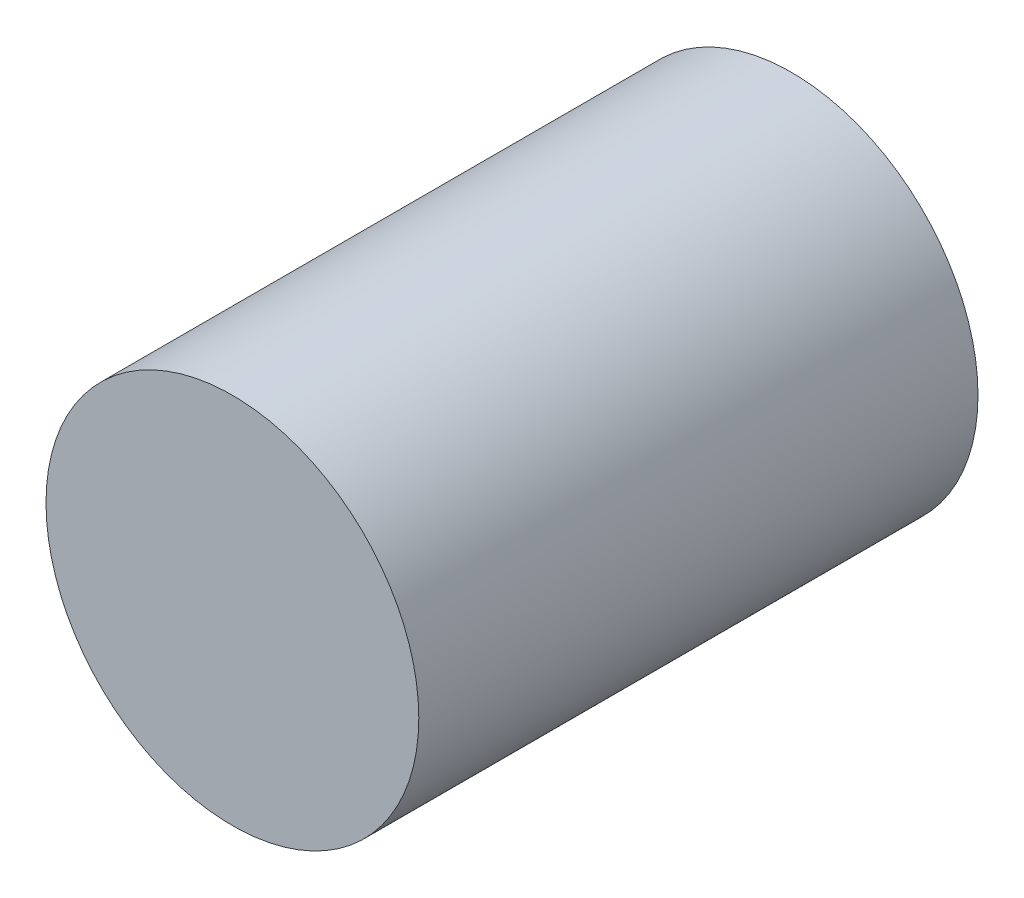
ISO-10303-21;
HEADER;
FILE_DESCRIPTION(('STEP AP214'),'2;1');
FILE_NAME('part.step','',(''),(''),'','','');
FILE_SCHEMA(('AUTOMOTIVE_DESIGN { 1 0 10303 214 1 1 1 1 }'));
ENDSEC;
DATA;
#1=APPLICATION_CONTEXT('core data for automotive mechanical design processes');
#2=APPLICATION_PROTOCOL_DEFINITION('international standard','automotive_design',2000,#1);
#3=PRODUCT_CONTEXT('',#1,'mechanical');
#4=PRODUCT('Part','Part','',(#3));
#5=PRODUCT_RELATED_PRODUCT_CATEGORY('part','',(#4));
#6=PRODUCT_DEFINITION_FORMATION('','',#4);
#7=PRODUCT_DEFINITION_CONTEXT('part definition',#1,'design');
#8=PRODUCT_DEFINITION('design','',#6,#7);
#9=PRODUCT_DEFINITION_SHAPE('','',#8);
#10=(LENGTH_UNIT() NAMED_UNIT(*) SI_UNIT(.MILLI.,.METRE.));
#11=(NAMED_UNIT(*) PLANE_ANGLE_UNIT() SI_UNIT($,.RADIAN.));
#12=(NAMED_UNIT(*) SI_UNIT($,.STERADIAN.) SOLID_ANGLE_UNIT());
#13=UNCERTAINTY_MEASURE_WITH_UNIT(LENGTH_MEASURE(1.E-05),#10,'distance_accuracy_value','');
#14=(GEOMETRIC_REPRESENTATION_CONTEXT(3) GLOBAL_UNCERTAINTY_ASSIGNED_CONTEXT((#13)) GLOBAL_UNIT_ASSIGNED_CONTEXT((#10,
#11,#12)) REPRESENTATION_CONTEXT('',''));
#15=CARTESIAN_POINT('',(0.,0.,0.));
#16=DIRECTION('',(0.,0.,1.));
#17=DIRECTION('',(1.,0.,0.));
#18=AXIS2_PLACEMENT_3D('',#15,#16,#17);
#19=CARTESIAN_POINT('',(0.,0.,19.05));
#20=DIRECTION('',(0.,0.,-1.));
#21=DIRECTION('',(-1.,0.,0.));
#22=AXIS2_PLACEMENT_3D('',#19,#20,#21);
#23=CYLINDRICAL_SURFACE('',#22,6.35);
#24=CARTESIAN_POINT('',(0.,0.,19.05));
#25=DIRECTION('',(0.,0.,1.));
#26=DIRECTION('',(1.,0.,0.));
#27=AXIS2_PLACEMENT_3D('',#24,#25,#26);
#28=CIRCLE('',#27,6.35);
#29=CARTESIAN_POINT('',(-6.35,0.,19.05));
#30=VERTEX_POINT('',#29);
#31=EDGE_CURVE('E10',#30,#30,#28,.T.);
#32=CARTESIAN_POINT('',(0.,0.,0.));
#33=DIRECTION('',(0.,0.,1.));
#34=DIRECTION('',(1.,0.,0.));
#35=AXIS2_PLACEMENT_3D('',#32,#33,#34);
#36=CIRCLE('',#35,6.35);
#37=CARTESIAN_POINT('',(-6.35,0.,0.));
#38=VERTEX_POINT('',#37);
#39=EDGE_CURVE('E36',#38,#38,#36,.T.);
#40=CARTESIAN_POINT('',(-6.35,0.,19.05));
#41=CARTESIAN_POINT('',(-6.35,0.,18.8515625));
#42=CARTESIAN_POINT('',(-6.35,0.,18.653125));
#43=CARTESIAN_POINT('',(-6.35,0.,18.25625));
#44=CARTESIAN_POINT('',(-6.35,0.,18.0578125));
#45=CARTESIAN_POINT('',(-6.35,0.,17.6609375));
#46=CARTESIAN_POINT('',(-6.35,0.,17.4625));
#47=CARTESIAN_POINT('',(-6.35,0.,17.065625));
#48=CARTESIAN_POINT('',(-6.35,0.,16.8671875));
#49=CARTESIAN_POINT('',(-6.35,0.,16.4703125));
#50=CARTESIAN_POINT('',(-6.35,0.,16.271875));
#51=CARTESIAN_POINT('',(-6.35,0.,15.875));
#52=CARTESIAN_POINT('',(-6.35,0.,15.6765625));
#53=CARTESIAN_POINT('',(-6.35,0.,15.2796875));
#54=CARTESIAN_POINT('',(-6.35,0.,15.08125));
#55=CARTESIAN_POINT('',(-6.35,0.,14.684375));
#56=CARTESIAN_POINT('',(-6.35,0.,14.4859375));
#57=CARTESIAN_POINT('',(-6.35,0.,14.0890625));
#58=CARTESIAN_POINT('',(-6.35,0.,13.890625));
#59=CARTESIAN_POINT('',(-6.35,0.,13.49375));
#60=CARTESIAN_POINT('',(-6.35,0.,13.2953125));
#61=CARTESIAN_POINT('',(-6.35,0.,12.8984375));
#62=CARTESIAN_POINT('',(-6.35,0.,12.7));
#63=CARTESIAN_POINT('',(-6.35,0.,12.303125));
#64=CARTESIAN_POINT('',(-6.35,0.,12.1046875));
#65=CARTESIAN_POINT('',(-6.35,0.,11.7078125));
#66=CARTESIAN_POINT('',(-6.35,0.,11.509375));
#67=CARTESIAN_POINT('',(-6.35,0.,11.1125));
#68=CARTESIAN_POINT('',(-6.35,0.,10.9140625));
#69=CARTESIAN_POINT('',(-6.35,0.,10.5171875));
#70=CARTESIAN_POINT('',(-6.35,0.,10.31875));
#71=CARTESIAN_POINT('',(-6.35,0.,9.921875));
#72=CARTESIAN_POINT('',(-6.35,0.,9.7234375));
#73=CARTESIAN_POINT('',(-6.35,0.,9.3265625));
#74=CARTESIAN_POINT('',(-6.35,0.,9.128125));
#75=CARTESIAN_POINT('',(-6.35,0.,8.73125));
#76=CARTESIAN_POINT('',(-6.35,0.,8.5328125));
#77=CARTESIAN_POINT('',(-6.35,0.,8.1359375));
#78=CARTESIAN_POINT('',(-6.35,0.,7.9375));
#79=CARTESIAN_POINT('',(-6.35,0.,7.540625));
#80=CARTESIAN_POINT('',(-6.35,0.,7.3421875));
#81=CARTESIAN_POINT('',(-6.35,0.,6.9453125));
#82=CARTESIAN_POINT('',(-6.35,0.,6.746875));
#83=CARTESIAN_POINT('',(-6.35,0.,6.35));
#84=CARTESIAN_POINT('',(-6.35,0.,6.1515625));
#85=CARTESIAN_POINT('',(-6.35,0.,5.7546875));
#86=CARTESIAN_POINT('',(-6.35,0.,5.55625));
#87=CARTESIAN_POINT('',(-6.35,0.,5.159375));
#88=CARTESIAN_POINT('',(-6.35,0.,4.9609375));
#89=CARTESIAN_POINT('',(-6.35,0.,4.5640625));
#90=CARTESIAN_POINT('',(-6.35,0.,4.365625));
#91=CARTESIAN_POINT('',(-6.35,0.,3.96875));
#92=CARTESIAN_POINT('',(-6.35,0.,3.7703125));
#93=CARTESIAN_POINT('',(-6.35,0.,3.3734375));
#94=CARTESIAN_POINT('',(-6.35,0.,3.175));
#95=CARTESIAN_POINT('',(-6.35,0.,2.778125));
#96=CARTESIAN_POINT('',(-6.35,0.,2.5796875));
#97=CARTESIAN_POINT('',(-6.35,0.,2.1828125));
#98=CARTESIAN_POINT('',(-6.35,0.,1.984375));
#99=CARTESIAN_POINT('',(-6.35,0.,1.5875));
#100=CARTESIAN_POINT('',(-6.35,0.,1.3890625));
#101=CARTESIAN_POINT('',(-6.35,0.,0.992187500000001));
#102=CARTESIAN_POINT('',(-6.35,0.,0.793750000000001));
#103=CARTESIAN_POINT('',(-6.35,0.,0.396875));
#104=CARTESIAN_POINT('',(-6.35,0.,0.1984375));
#105=CARTESIAN_POINT('',(-6.35,0.,0.));
#106=B_SPLINE_CURVE_WITH_KNOTS('',3,(#40,#41,#42,#43,#44,#45,#46,#47,#48,#49,#50,#51,#52,#53,
#54,#55,#56,#57,#58,#59,#60,#61,#62,#63,#64,#65,#66,#67,#68,#69,#70,#71,#72,#73,#74,#75,#76,#77,
#78,#79,#80,#81,#82,#83,#84,#85,#86,#87,#88,#89,#90,#91,#92,#93,#94,#95,#96,#97,#98,#99,#100,
#101,#102,#103,#104,#105),.UNSPECIFIED.,.F.,.F.,(4,2,2,2,2,2,2,2,2,2,2,2,2,2,2,2,2,2,2,2,2,2,2,
2,2,2,2,2,2,2,2,2,4),(0.,0.5953125,1.190625,1.7859375,2.38125,2.9765625,3.571875,4.1671875,
4.7625,5.3578125,5.953125,6.5484375,7.14375,7.7390625,8.334375,8.9296875,9.525,10.1203125,
10.715625,11.3109375,11.90625,12.5015625,13.096875,13.6921875,14.2875,14.8828125,15.478125,
16.0734375,16.66875,17.2640625,17.859375,18.4546875,19.05),.UNSPECIFIED.);
#107=EDGE_CURVE('BSEAM33',#30,#38,#106,.T.);
#108=ORIENTED_EDGE('',*,*,#31,.F.);
#109=ORIENTED_EDGE('',*,*,#39,.T.);
#110=ORIENTED_EDGE('',*,*,#107,.T.);
#111=ORIENTED_EDGE('',*,*,#107,.F.);
#112=EDGE_LOOP('',(#108,#110,#109,#111));
#113=FACE_BOUND('',#112,.T.);
#114=ADVANCED_FACE('F33',(#113),#23,.T.);
#115=CARTESIAN_POINT('',(0.,0.,19.05));
#116=DIRECTION('',(0.,0.,1.));
#117=DIRECTION('',(1.,0.,0.));
#118=AXIS2_PLACEMENT_3D('',#115,#116,#117);
#119=PLANE('',#118);
#120=ORIENTED_EDGE('',*,*,#31,.T.);
#121=EDGE_LOOP('',(#120));
#122=FACE_BOUND('',#121,.T.);
#123=ADVANCED_FACE('F48',(#122),#119,.T.);
#124=CARTESIAN_POINT('',(0.,0.,0.));
#125=DIRECTION('',(0.,0.,1.));
#126=DIRECTION('',(1.,0.,0.));
#127=AXIS2_PLACEMENT_3D('',#124,#125,#126);
#128=PLANE('',#127);
#129=ORIENTED_EDGE('',*,*,#39,.F.);
#130=EDGE_LOOP('',(#129));
#131=FACE_BOUND('',#130,.T.);
#132=ADVANCED_FACE('F46',(#131),#128,.F.);
#133=CLOSED_SHELL('',(#114,#123,#132));
#134=MANIFOLD_SOLID_BREP('B2',#133);
#135=ADVANCED_BREP_SHAPE_REPRESENTATION('',(#18,#134),#14);
#136=SHAPE_DEFINITION_REPRESENTATION(#9,#135);
ENDSEC;
END-ISO-10303-21;
